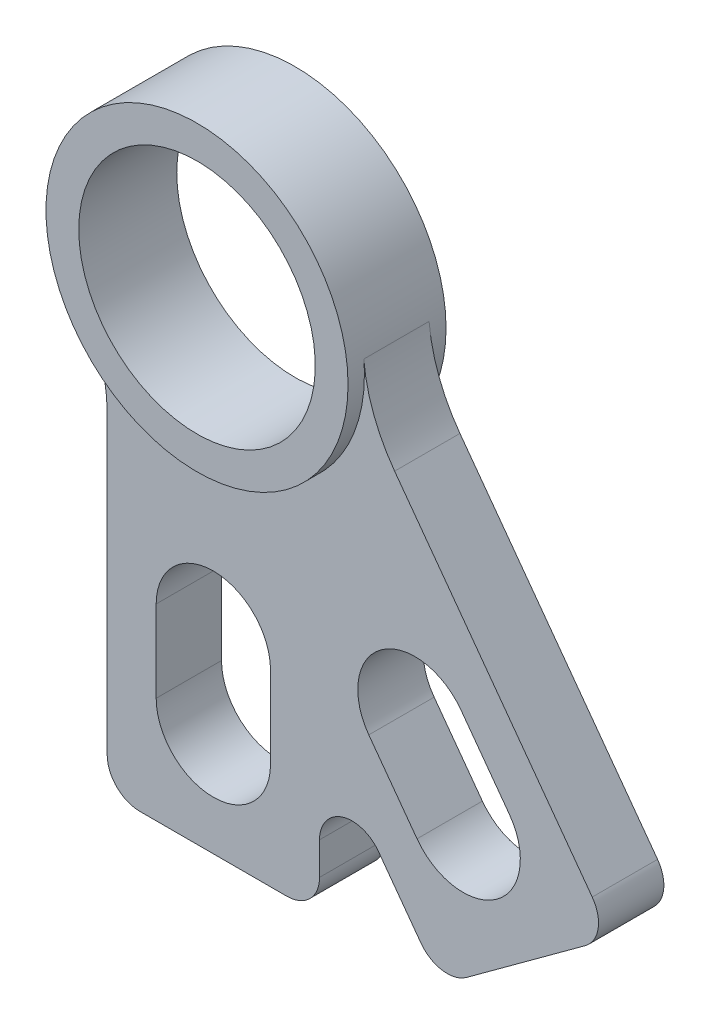
ISO-10303-21;
HEADER;
FILE_DESCRIPTION(('STEP AP214'),'2;1');
FILE_NAME('part.step','',(''),(''),'','','');
FILE_SCHEMA(('AUTOMOTIVE_DESIGN { 1 0 10303 214 1 1 1 1 }'));
ENDSEC;
DATA;
#1=APPLICATION_CONTEXT('core data for automotive mechanical design processes');
#2=APPLICATION_PROTOCOL_DEFINITION('international standard','automotive_design',2000,#1);
#3=PRODUCT_CONTEXT('',#1,'mechanical');
#4=PRODUCT('Part','Part','',(#3));
#5=PRODUCT_RELATED_PRODUCT_CATEGORY('part','',(#4));
#6=PRODUCT_DEFINITION_FORMATION('','',#4);
#7=PRODUCT_DEFINITION_CONTEXT('part definition',#1,'design');
#8=PRODUCT_DEFINITION('design','',#6,#7);
#9=PRODUCT_DEFINITION_SHAPE('','',#8);
#10=(LENGTH_UNIT() NAMED_UNIT(*) SI_UNIT(.MILLI.,.METRE.));
#11=(NAMED_UNIT(*) PLANE_ANGLE_UNIT() SI_UNIT($,.RADIAN.));
#12=(NAMED_UNIT(*) SI_UNIT($,.STERADIAN.) SOLID_ANGLE_UNIT());
#13=UNCERTAINTY_MEASURE_WITH_UNIT(LENGTH_MEASURE(1.E-05),#10,'distance_accuracy_value','');
#14=(GEOMETRIC_REPRESENTATION_CONTEXT(3) GLOBAL_UNCERTAINTY_ASSIGNED_CONTEXT((#13)) GLOBAL_UNIT_ASSIGNED_CONTEXT((#10,
#11,#12)) REPRESENTATION_CONTEXT('',''));
#15=CARTESIAN_POINT('',(0.,0.,0.));
#16=DIRECTION('',(0.,0.,1.));
#17=DIRECTION('',(1.,0.,0.));
#18=AXIS2_PLACEMENT_3D('',#15,#16,#17);
#19=CARTESIAN_POINT('',(0.,0.,4.7625));
#20=DIRECTION('',(0.,0.,-1.));
#21=DIRECTION('',(-1.,0.,0.));
#22=AXIS2_PLACEMENT_3D('',#19,#20,#21);
#23=CYLINDRICAL_SURFACE('',#22,11.495405);
#24=CARTESIAN_POINT('',(0.,0.,4.7625));
#25=DIRECTION('',(0.,0.,1.));
#26=DIRECTION('',(1.,0.,0.));
#27=AXIS2_PLACEMENT_3D('',#24,#25,#26);
#28=CIRCLE('',#27,11.495405);
#29=CARTESIAN_POINT('',(-11.495405,0.,4.7625));
#30=VERTEX_POINT('',#29);
#31=EDGE_CURVE('E358',#30,#30,#28,.T.);
#32=CARTESIAN_POINT('',(0.,0.,-4.7625));
#33=DIRECTION('',(0.,0.,1.));
#34=DIRECTION('',(1.,0.,0.));
#35=AXIS2_PLACEMENT_3D('',#32,#33,#34);
#36=CIRCLE('',#35,11.495405);
#37=CARTESIAN_POINT('',(-11.495405,0.,-4.7625));
#38=VERTEX_POINT('',#37);
#39=EDGE_CURVE('E315',#38,#38,#36,.T.);
#40=CARTESIAN_POINT('',(-11.495405,0.,4.7625));
#41=CARTESIAN_POINT('',(-11.495405,0.,4.66328125));
#42=CARTESIAN_POINT('',(-11.495405,0.,4.5640625));
#43=CARTESIAN_POINT('',(-11.495405,0.,4.365625));
#44=CARTESIAN_POINT('',(-11.495405,0.,4.26640625));
#45=CARTESIAN_POINT('',(-11.495405,0.,4.06796875));
#46=CARTESIAN_POINT('',(-11.495405,0.,3.96875));
#47=CARTESIAN_POINT('',(-11.495405,0.,3.7703125));
#48=CARTESIAN_POINT('',(-11.495405,0.,3.67109375));
#49=CARTESIAN_POINT('',(-11.495405,0.,3.47265625));
#50=CARTESIAN_POINT('',(-11.495405,0.,3.3734375));
#51=CARTESIAN_POINT('',(-11.495405,0.,3.175));
#52=CARTESIAN_POINT('',(-11.495405,0.,3.07578125));
#53=CARTESIAN_POINT('',(-11.495405,0.,2.87734375));
#54=CARTESIAN_POINT('',(-11.495405,0.,2.778125));
#55=CARTESIAN_POINT('',(-11.495405,0.,2.5796875));
#56=CARTESIAN_POINT('',(-11.495405,0.,2.48046875));
#57=CARTESIAN_POINT('',(-11.495405,0.,2.28203125));
#58=CARTESIAN_POINT('',(-11.495405,0.,2.1828125));
#59=CARTESIAN_POINT('',(-11.495405,0.,1.984375));
#60=CARTESIAN_POINT('',(-11.495405,0.,1.88515625));
#61=CARTESIAN_POINT('',(-11.495405,0.,1.68671875));
#62=CARTESIAN_POINT('',(-11.495405,0.,1.5875));
#63=CARTESIAN_POINT('',(-11.495405,0.,1.3890625));
#64=CARTESIAN_POINT('',(-11.495405,0.,1.28984375));
#65=CARTESIAN_POINT('',(-11.495405,0.,1.09140625));
#66=CARTESIAN_POINT('',(-11.495405,0.,0.992187499999999));
#67=CARTESIAN_POINT('',(-11.495405,0.,0.79375));
#68=CARTESIAN_POINT('',(-11.495405,0.,0.69453125));
#69=CARTESIAN_POINT('',(-11.495405,0.,0.49609375));
#70=CARTESIAN_POINT('',(-11.495405,0.,0.396875));
#71=CARTESIAN_POINT('',(-11.495405,0.,0.1984375));
#72=CARTESIAN_POINT('',(-11.495405,0.,0.0992187500000001));
#73=CARTESIAN_POINT('',(-11.495405,0.,-0.0992187500000001));
#74=CARTESIAN_POINT('',(-11.495405,0.,-0.1984375));
#75=CARTESIAN_POINT('',(-11.495405,0.,-0.396875));
#76=CARTESIAN_POINT('',(-11.495405,0.,-0.49609375));
#77=CARTESIAN_POINT('',(-11.495405,0.,-0.69453125));
#78=CARTESIAN_POINT('',(-11.495405,0.,-0.793750000000001));
#79=CARTESIAN_POINT('',(-11.495405,0.,-0.992187500000001));
#80=CARTESIAN_POINT('',(-11.495405,0.,-1.09140625));
#81=CARTESIAN_POINT('',(-11.495405,0.,-1.28984375));
#82=CARTESIAN_POINT('',(-11.495405,0.,-1.3890625));
#83=CARTESIAN_POINT('',(-11.495405,0.,-1.5875));
#84=CARTESIAN_POINT('',(-11.495405,0.,-1.68671875));
#85=CARTESIAN_POINT('',(-11.495405,0.,-1.88515625));
#86=CARTESIAN_POINT('',(-11.495405,0.,-1.984375));
#87=CARTESIAN_POINT('',(-11.495405,0.,-2.1828125));
#88=CARTESIAN_POINT('',(-11.495405,0.,-2.28203125));
#89=CARTESIAN_POINT('',(-11.495405,0.,-2.48046875));
#90=CARTESIAN_POINT('',(-11.495405,0.,-2.5796875));
#91=CARTESIAN_POINT('',(-11.495405,0.,-2.778125));
#92=CARTESIAN_POINT('',(-11.495405,0.,-2.87734375));
#93=CARTESIAN_POINT('',(-11.495405,0.,-3.07578125));
#94=CARTESIAN_POINT('',(-11.495405,0.,-3.175));
#95=CARTESIAN_POINT('',(-11.495405,0.,-3.3734375));
#96=CARTESIAN_POINT('',(-11.495405,0.,-3.47265625));
#97=CARTESIAN_POINT('',(-11.495405,0.,-3.67109375));
#98=CARTESIAN_POINT('',(-11.495405,0.,-3.7703125));
#99=CARTESIAN_POINT('',(-11.495405,0.,-3.96875));
#100=CARTESIAN_POINT('',(-11.495405,0.,-4.06796875));
#101=CARTESIAN_POINT('',(-11.495405,0.,-4.26640625));
#102=CARTESIAN_POINT('',(-11.495405,0.,-4.365625));
#103=CARTESIAN_POINT('',(-11.495405,0.,-4.5640625));
#104=CARTESIAN_POINT('',(-11.495405,0.,-4.66328125));
#105=CARTESIAN_POINT('',(-11.495405,0.,-4.7625));
#106=B_SPLINE_CURVE_WITH_KNOTS('',3,(#40,#41,#42,#43,#44,#45,#46,#47,#48,#49,#50,#51,#52,#53,
#54,#55,#56,#57,#58,#59,#60,#61,#62,#63,#64,#65,#66,#67,#68,#69,#70,#71,#72,#73,#74,#75,#76,#77,
#78,#79,#80,#81,#82,#83,#84,#85,#86,#87,#88,#89,#90,#91,#92,#93,#94,#95,#96,#97,#98,#99,#100,
#101,#102,#103,#104,#105),.UNSPECIFIED.,.F.,.F.,(4,2,2,2,2,2,2,2,2,2,2,2,2,2,2,2,2,2,2,2,2,2,2,
2,2,2,2,2,2,2,2,2,4),(0.,0.29765625,0.5953125,0.892968750000001,1.190625,1.48828125,1.7859375,
2.08359375,2.38125,2.67890625,2.9765625,3.27421875,3.571875,3.86953125,4.1671875,4.46484375,
4.7625,5.06015625,5.3578125,5.65546875,5.953125,6.25078125,6.5484375,6.84609375,7.14375,
7.44140625,7.7390625,8.03671875,8.334375,8.63203125,8.9296875,9.22734375,9.525),.UNSPECIFIED.);
#107=EDGE_CURVE('BSEAM43',#30,#38,#106,.T.);
#108=ORIENTED_EDGE('',*,*,#31,.T.);
#109=ORIENTED_EDGE('',*,*,#39,.F.);
#110=ORIENTED_EDGE('',*,*,#107,.T.);
#111=ORIENTED_EDGE('',*,*,#107,.F.);
#112=EDGE_LOOP('',(#108,#110,#109,#111));
#113=FACE_BOUND('',#112,.T.);
#114=ADVANCED_FACE('F43',(#113),#23,.F.);
#115=CARTESIAN_POINT('',(0.,0.,4.7625));
#116=DIRECTION('',(0.,0.,-1.));
#117=DIRECTION('',(-1.,0.,0.));
#118=AXIS2_PLACEMENT_3D('',#115,#116,#117);
#119=CYLINDRICAL_SURFACE('',#118,14.6812);
#120=DIRECTION('',(0.,0.,-1.));
#121=VECTOR('',#120,1.);
#122=CARTESIAN_POINT('',(-12.585193266832,-7.55979787272687,3.175));
#123=LINE('',#122,#121);
#124=CARTESIAN_POINT('',(-12.585193266832,-7.55979787272688,3.175));
#125=VERTEX_POINT('',#124);
#126=CARTESIAN_POINT('',(-12.585193266832,-7.55979787272687,-3.175));
#127=VERTEX_POINT('',#126);
#128=EDGE_CURVE('E228',#125,#127,#123,.T.);
#129=ORIENTED_EDGE('',*,*,#128,.F.);
#130=CARTESIAN_POINT('',(0.,0.,3.175));
#131=DIRECTION('',(0.,0.,1.));
#132=DIRECTION('',(1.,0.,0.));
#133=AXIS2_PLACEMENT_3D('',#130,#131,#132);
#134=CIRCLE('',#133,14.6812);
#135=CARTESIAN_POINT('',(14.6206592886557,1.33189917224908,3.175));
#136=VERTEX_POINT('',#135);
#137=EDGE_CURVE('E244',#125,#136,#134,.T.);
#138=ORIENTED_EDGE('',*,*,#137,.T.);
#139=DIRECTION('',(0.,0.,-1.));
#140=VECTOR('',#139,1.);
#141=CARTESIAN_POINT('',(14.620659288656,1.33189917224865,3.175));
#142=LINE('',#141,#140);
#143=CARTESIAN_POINT('',(14.620659288656,1.33189917224865,-3.175));
#144=VERTEX_POINT('',#143);
#145=EDGE_CURVE('E350',#136,#144,#142,.T.);
#146=ORIENTED_EDGE('',*,*,#145,.T.);
#147=CARTESIAN_POINT('',(0.,0.,-3.175));
#148=DIRECTION('',(0.,0.,1.));
#149=DIRECTION('',(1.,0.,0.));
#150=AXIS2_PLACEMENT_3D('',#147,#148,#149);
#151=CIRCLE('',#150,14.6812);
#152=EDGE_CURVE('E513',#127,#144,#151,.T.);
#153=ORIENTED_EDGE('',*,*,#152,.F.);
#154=EDGE_LOOP('',(#129,#138,#146,#153));
#155=FACE_BOUND('',#154,.T.);
#156=CARTESIAN_POINT('',(0.,0.,4.7625));
#157=DIRECTION('',(0.,0.,1.));
#158=DIRECTION('',(1.,0.,0.));
#159=AXIS2_PLACEMENT_3D('',#156,#157,#158);
#160=CIRCLE('',#159,14.6812);
#161=CARTESIAN_POINT('',(14.6812,0.,4.7625));
#162=VERTEX_POINT('',#161);
#163=EDGE_CURVE('E478',#162,#162,#160,.T.);
#164=ORIENTED_EDGE('',*,*,#163,.F.);
#165=EDGE_LOOP('',(#164));
#166=FACE_BOUND('',#165,.T.);
#167=CARTESIAN_POINT('',(0.,0.,-4.7625));
#168=DIRECTION('',(0.,0.,1.));
#169=DIRECTION('',(1.,0.,0.));
#170=AXIS2_PLACEMENT_3D('',#167,#168,#169);
#171=CIRCLE('',#170,14.6812);
#172=CARTESIAN_POINT('',(14.6812,0.,-4.7625));
#173=VERTEX_POINT('',#172);
#174=EDGE_CURVE('E842',#173,#173,#171,.T.);
#175=ORIENTED_EDGE('',*,*,#174,.T.);
#176=EDGE_LOOP('',(#175));
#177=FACE_BOUND('',#176,.T.);
#178=ADVANCED_FACE('F600',(#155,#166,#177),#119,.T.);
#179=CARTESIAN_POINT('',(0.,0.,4.7625));
#180=DIRECTION('',(0.,0.,1.));
#181=DIRECTION('',(1.,0.,0.));
#182=AXIS2_PLACEMENT_3D('',#179,#180,#181);
#183=PLANE('',#182);
#184=ORIENTED_EDGE('',*,*,#31,.F.);
#185=EDGE_LOOP('',(#184));
#186=FACE_BOUND('',#185,.T.);
#187=ORIENTED_EDGE('',*,*,#163,.T.);
#188=EDGE_LOOP('',(#187));
#189=FACE_BOUND('',#188,.T.);
#190=ADVANCED_FACE('F606',(#186,#189),#183,.T.);
#191=CARTESIAN_POINT('',(0.,0.,-4.7625));
#192=DIRECTION('',(0.,0.,1.));
#193=DIRECTION('',(1.,0.,0.));
#194=AXIS2_PLACEMENT_3D('',#191,#192,#193);
#195=PLANE('',#194);
#196=ORIENTED_EDGE('',*,*,#39,.T.);
#197=EDGE_LOOP('',(#196));
#198=FACE_BOUND('',#197,.T.);
#199=ORIENTED_EDGE('',*,*,#174,.F.);
#200=EDGE_LOOP('',(#199));
#201=FACE_BOUND('',#200,.T.);
#202=ADVANCED_FACE('F611',(#198,#201),#195,.F.);
#203=CARTESIAN_POINT('',(0.,-29.3687499999984,3.175));
#204=DIRECTION('',(0.,0.,-1.));
#205=DIRECTION('',(-1.,0.,0.));
#206=AXIS2_PLACEMENT_3D('',#203,#204,#205);
#207=CYLINDRICAL_SURFACE('',#206,5.55624999999838);
#208=CARTESIAN_POINT('',(0.,-29.3687499999984,-3.175));
#209=DIRECTION('',(0.,0.,1.));
#210=DIRECTION('',(1.,0.,0.));
#211=AXIS2_PLACEMENT_3D('',#208,#209,#210);
#212=CIRCLE('',#211,5.55624999999838);
#213=CARTESIAN_POINT('',(5.55624999999832,-29.3687499999984,-3.175));
#214=VERTEX_POINT('',#213);
#215=CARTESIAN_POINT('',(-5.55624999999843,-29.3687499999984,-3.175));
#216=VERTEX_POINT('',#215);
#217=EDGE_CURVE('E409',#214,#216,#212,.T.);
#218=ORIENTED_EDGE('',*,*,#217,.F.);
#219=DIRECTION('',(0.,0.,-1.));
#220=VECTOR('',#219,1.);
#221=CARTESIAN_POINT('',(5.55624999999832,-29.3687499999984,3.175));
#222=LINE('',#221,#220);
#223=CARTESIAN_POINT('',(5.55624999999832,-29.3687499999984,3.175));
#224=VERTEX_POINT('',#223);
#225=EDGE_CURVE('E311',#224,#214,#222,.T.);
#226=ORIENTED_EDGE('',*,*,#225,.F.);
#227=CARTESIAN_POINT('',(0.,-29.3687499999984,3.175));
#228=DIRECTION('',(0.,0.,1.));
#229=DIRECTION('',(1.,0.,0.));
#230=AXIS2_PLACEMENT_3D('',#227,#228,#229);
#231=CIRCLE('',#230,5.55624999999838);
#232=CARTESIAN_POINT('',(-5.55624999999843,-29.3687499999984,3.175));
#233=VERTEX_POINT('',#232);
#234=EDGE_CURVE('E288',#224,#233,#231,.T.);
#235=ORIENTED_EDGE('',*,*,#234,.T.);
#236=DIRECTION('',(0.,0.,-1.));
#237=VECTOR('',#236,1.);
#238=CARTESIAN_POINT('',(-5.55624999999843,-29.3687499999984,3.175));
#239=LINE('',#238,#237);
#240=EDGE_CURVE('E334',#233,#216,#239,.T.);
#241=ORIENTED_EDGE('',*,*,#240,.T.);
#242=EDGE_LOOP('',(#218,#226,#235,#241));
#243=FACE_BOUND('',#242,.T.);
#244=ADVANCED_FACE('F432',(#243),#207,.F.);
#245=CARTESIAN_POINT('',(5.55624999999988,-2.93862156830347E-13,3.175));
#246=DIRECTION('',(-1.,0.,0.));
#247=DIRECTION('',(0.,-1.,0.));
#248=AXIS2_PLACEMENT_3D('',#245,#246,#247);
#249=PLANE('',#248);
#250=DIRECTION('',(0.,1.,0.));
#251=VECTOR('',#250,1.);
#252=CARTESIAN_POINT('',(5.55624999999988,-2.93862156830347E-13,-3.175));
#253=LINE('',#252,#251);
#254=CARTESIAN_POINT('',(5.5562499999979,-37.3062500000015,-3.175));
#255=VERTEX_POINT('',#254);
#256=EDGE_CURVE('E412',#255,#214,#253,.T.);
#257=ORIENTED_EDGE('',*,*,#256,.F.);
#258=DIRECTION('',(0.,0.,-1.));
#259=VECTOR('',#258,1.);
#260=CARTESIAN_POINT('',(5.5562499999979,-37.3062500000015,3.175));
#261=LINE('',#260,#259);
#262=CARTESIAN_POINT('',(5.5562499999979,-37.3062500000015,3.175));
#263=VERTEX_POINT('',#262);
#264=EDGE_CURVE('E316',#263,#255,#261,.T.);
#265=ORIENTED_EDGE('',*,*,#264,.F.);
#266=DIRECTION('',(0.,1.,0.));
#267=VECTOR('',#266,1.);
#268=CARTESIAN_POINT('',(5.55624999999988,-2.93862156830347E-13,3.175));
#269=LINE('',#268,#267);
#270=EDGE_CURVE('E292',#263,#224,#269,.T.);
#271=ORIENTED_EDGE('',*,*,#270,.T.);
#272=ORIENTED_EDGE('',*,*,#225,.T.);
#273=EDGE_LOOP('',(#257,#265,#271,#272));
#274=FACE_BOUND('',#273,.T.);
#275=ADVANCED_FACE('F438',(#274),#249,.T.);
#276=CARTESIAN_POINT('',(7.71771132129446E-13,-37.3062500000015,3.175));
#277=DIRECTION('',(0.,0.,-1.));
#278=DIRECTION('',(-1.,0.,0.));
#279=AXIS2_PLACEMENT_3D('',#276,#277,#278);
#280=CYLINDRICAL_SURFACE('',#279,5.55624999999779);
#281=CARTESIAN_POINT('',(7.71771132129446E-13,-37.3062500000015,-3.175));
#282=DIRECTION('',(0.,0.,1.));
#283=DIRECTION('',(1.,0.,0.));
#284=AXIS2_PLACEMENT_3D('',#281,#282,#283);
#285=CIRCLE('',#284,5.55624999999779);
#286=CARTESIAN_POINT('',(-5.55624999999768,-37.3062500000015,-3.175));
#287=VERTEX_POINT('',#286);
#288=EDGE_CURVE('E417',#287,#255,#285,.T.);
#289=ORIENTED_EDGE('',*,*,#288,.F.);
#290=DIRECTION('',(0.,0.,-1.));
#291=VECTOR('',#290,1.);
#292=CARTESIAN_POINT('',(-5.55624999999768,-37.3062500000015,3.175));
#293=LINE('',#292,#291);
#294=CARTESIAN_POINT('',(-5.55624999999768,-37.3062500000015,3.175));
#295=VERTEX_POINT('',#294);
#296=EDGE_CURVE('E337',#295,#287,#293,.T.);
#297=ORIENTED_EDGE('',*,*,#296,.F.);
#298=CARTESIAN_POINT('',(7.71771132129446E-13,-37.3062500000015,3.175));
#299=DIRECTION('',(0.,0.,1.));
#300=DIRECTION('',(1.,0.,0.));
#301=AXIS2_PLACEMENT_3D('',#298,#299,#300);
#302=CIRCLE('',#301,5.55624999999779);
#303=EDGE_CURVE('E297',#295,#263,#302,.T.);
#304=ORIENTED_EDGE('',*,*,#303,.T.);
#305=ORIENTED_EDGE('',*,*,#264,.T.);
#306=EDGE_LOOP('',(#289,#297,#304,#305));
#307=FACE_BOUND('',#306,.T.);
#308=ADVANCED_FACE('F642',(#307),#280,.F.);
#309=CARTESIAN_POINT('',(19.594586402296,-26.774645381131,3.175));
#310=DIRECTION('',(0.,0.,-1.));
#311=DIRECTION('',(-1.,0.,0.));
#312=AXIS2_PLACEMENT_3D('',#309,#310,#311);
#313=CYLINDRICAL_SURFACE('',#312,5.55624999999852);
#314=CARTESIAN_POINT('',(19.594586402296,-26.774645381131,-3.175));
#315=DIRECTION('',(0.,0.,1.));
#316=DIRECTION('',(1.,0.,0.));
#317=AXIS2_PLACEMENT_3D('',#314,#315,#316);
#318=CIRCLE('',#317,5.55624999999852);
#319=CARTESIAN_POINT('',(24.078378691002,-23.4932553137613,-3.175));
#320=VERTEX_POINT('',#319);
#321=CARTESIAN_POINT('',(15.1107941135917,-30.0560354485005,-3.175));
#322=VERTEX_POINT('',#321);
#323=EDGE_CURVE('E390',#320,#322,#318,.T.);
#324=ORIENTED_EDGE('',*,*,#323,.F.);
#325=DIRECTION('',(0.,0.,-1.));
#326=VECTOR('',#325,1.);
#327=CARTESIAN_POINT('',(24.078378691002,-23.4932553137613,3.175));
#328=LINE('',#327,#326);
#329=CARTESIAN_POINT('',(24.078378691002,-23.4932553137613,3.175));
#330=VERTEX_POINT('',#329);
#331=EDGE_CURVE('E338',#330,#320,#328,.T.);
#332=ORIENTED_EDGE('',*,*,#331,.F.);
#333=CARTESIAN_POINT('',(19.594586402296,-26.774645381131,3.175));
#334=DIRECTION('',(0.,0.,1.));
#335=DIRECTION('',(1.,0.,0.));
#336=AXIS2_PLACEMENT_3D('',#333,#334,#335);
#337=CIRCLE('',#336,5.55624999999852);
#338=CARTESIAN_POINT('',(15.1107941135917,-30.0560354485005,3.175));
#339=VERTEX_POINT('',#338);
#340=EDGE_CURVE('E263',#330,#339,#337,.T.);
#341=ORIENTED_EDGE('',*,*,#340,.T.);
#342=DIRECTION('',(0.,0.,-1.));
#343=VECTOR('',#342,1.);
#344=CARTESIAN_POINT('',(15.1107941135917,-30.0560354485005,3.175));
#345=LINE('',#344,#343);
#346=EDGE_CURVE('E319',#339,#322,#345,.T.);
#347=ORIENTED_EDGE('',*,*,#346,.T.);
#348=EDGE_LOOP('',(#324,#332,#341,#347));
#349=FACE_BOUND('',#348,.T.);
#350=ADVANCED_FACE('F638',(#349),#313,.F.);
#351=CARTESIAN_POINT('',(4.48379228870516,3.28139006736958,3.175));
#352=DIRECTION('',(-0.806981739249737,-0.590576390077921,0.));
#353=DIRECTION('',(0.590576390077921,-0.806981739249738,0.));
#354=AXIS2_PLACEMENT_3D('',#351,#352,#353);
#355=PLANE('',#354);
#356=DIRECTION('',(-0.590576390077921,0.806981739249737,0.));
#357=VECTOR('',#356,1.);
#358=CARTESIAN_POINT('',(4.48379228870516,3.28139006736958,-3.175));
#359=LINE('',#358,#357);
#360=CARTESIAN_POINT('',(28.7660787872476,-29.8986728690589,-3.175));
#361=VERTEX_POINT('',#360);
#362=EDGE_CURVE('E396',#361,#320,#359,.T.);
#363=ORIENTED_EDGE('',*,*,#362,.F.);
#364=DIRECTION('',(0.,0.,-1.));
#365=VECTOR('',#364,1.);
#366=CARTESIAN_POINT('',(28.7660787872476,-29.8986728690589,3.175));
#367=LINE('',#366,#365);
#368=CARTESIAN_POINT('',(28.7660787872476,-29.8986728690589,3.175));
#369=VERTEX_POINT('',#368);
#370=EDGE_CURVE('E348',#369,#361,#367,.T.);
#371=ORIENTED_EDGE('',*,*,#370,.F.);
#372=DIRECTION('',(-0.590576390077921,0.806981739249737,0.));
#373=VECTOR('',#372,1.);
#374=CARTESIAN_POINT('',(4.48379228870516,3.28139006736958,3.175));
#375=LINE('',#374,#373);
#376=EDGE_CURVE('E268',#369,#330,#375,.T.);
#377=ORIENTED_EDGE('',*,*,#376,.T.);
#378=ORIENTED_EDGE('',*,*,#331,.T.);
#379=EDGE_LOOP('',(#363,#371,#377,#378));
#380=FACE_BOUND('',#379,.T.);
#381=ADVANCED_FACE('F641',(#380),#355,.T.);
#382=CARTESIAN_POINT('',(24.282286498542,-33.1800629364281,3.175));
#383=DIRECTION('',(0.,0.,-1.));
#384=DIRECTION('',(-1.,0.,0.));
#385=AXIS2_PLACEMENT_3D('',#382,#383,#384);
#386=CYLINDRICAL_SURFACE('',#385,5.55624999999852);
#387=CARTESIAN_POINT('',(24.282286498542,-33.1800629364281,-3.175));
#388=DIRECTION('',(0.,0.,1.));
#389=DIRECTION('',(1.,0.,0.));
#390=AXIS2_PLACEMENT_3D('',#387,#388,#389);
#391=CIRCLE('',#390,5.55624999999852);
#392=CARTESIAN_POINT('',(19.7984942098372,-36.4614530037981,-3.175));
#393=VERTEX_POINT('',#392);
#394=EDGE_CURVE('E403',#393,#361,#391,.T.);
#395=ORIENTED_EDGE('',*,*,#394,.F.);
#396=DIRECTION('',(0.,0.,-1.));
#397=VECTOR('',#396,1.);
#398=CARTESIAN_POINT('',(19.7984942098372,-36.4614530037981,3.175));
#399=LINE('',#398,#397);
#400=CARTESIAN_POINT('',(19.7984942098372,-36.4614530037981,3.175));
#401=VERTEX_POINT('',#400);
#402=EDGE_CURVE('E323',#401,#393,#399,.T.);
#403=ORIENTED_EDGE('',*,*,#402,.F.);
#404=CARTESIAN_POINT('',(24.282286498542,-33.1800629364281,3.175));
#405=DIRECTION('',(0.,0.,1.));
#406=DIRECTION('',(1.,0.,0.));
#407=AXIS2_PLACEMENT_3D('',#404,#405,#406);
#408=CIRCLE('',#407,5.55624999999852);
#409=EDGE_CURVE('E275',#401,#369,#408,.T.);
#410=ORIENTED_EDGE('',*,*,#409,.T.);
#411=ORIENTED_EDGE('',*,*,#370,.T.);
#412=EDGE_LOOP('',(#395,#403,#410,#411));
#413=FACE_BOUND('',#412,.T.);
#414=ADVANCED_FACE('F620',(#413),#386,.F.);
#415=CARTESIAN_POINT('',(-26.1937499999968,-15.7343197939273,3.175));
#416=DIRECTION('',(0.,0.,-1.));
#417=DIRECTION('',(-1.,0.,0.));
#418=AXIS2_PLACEMENT_3D('',#415,#416,#417);
#419=CYLINDRICAL_SURFACE('',#418,15.8749999999984);
#420=CARTESIAN_POINT('',(-26.1937499999968,-15.7343197939273,-3.175));
#421=DIRECTION('',(0.,0.,1.));
#422=DIRECTION('',(1.,0.,0.));
#423=AXIS2_PLACEMENT_3D('',#420,#421,#422);
#424=CIRCLE('',#423,15.8749999999984);
#425=CARTESIAN_POINT('',(-10.3187499999984,-15.7343197939273,-3.175));
#426=VERTEX_POINT('',#425);
#427=EDGE_CURVE('E223',#426,#127,#424,.T.);
#428=ORIENTED_EDGE('',*,*,#427,.F.);
#429=DIRECTION('',(0.,0.,-1.));
#430=VECTOR('',#429,1.);
#431=CARTESIAN_POINT('',(-10.3187499999984,-15.7343197939273,3.175));
#432=LINE('',#431,#430);
#433=CARTESIAN_POINT('',(-10.3187499999984,-15.7343197939273,3.175));
#434=VERTEX_POINT('',#433);
#435=EDGE_CURVE('E216',#434,#426,#432,.T.);
#436=ORIENTED_EDGE('',*,*,#435,.F.);
#437=CARTESIAN_POINT('',(-26.1937499999968,-15.7343197939273,3.175));
#438=DIRECTION('',(0.,0.,1.));
#439=DIRECTION('',(1.,0.,0.));
#440=AXIS2_PLACEMENT_3D('',#437,#438,#439);
#441=CIRCLE('',#440,15.8749999999984);
#442=EDGE_CURVE('E221',#434,#125,#441,.T.);
#443=ORIENTED_EDGE('',*,*,#442,.T.);
#444=ORIENTED_EDGE('',*,*,#128,.T.);
#445=EDGE_LOOP('',(#428,#436,#443,#444));
#446=FACE_BOUND('',#445,.T.);
#447=ADVANCED_FACE('F218',(#446),#419,.F.);
#448=CARTESIAN_POINT('',(-10.3187499999987,-2.23396639561212E-13,3.175));
#449=DIRECTION('',(1.,0.,0.));
#450=DIRECTION('',(0.,1.,0.));
#451=AXIS2_PLACEMENT_3D('',#448,#449,#450);
#452=PLANE('',#451);
#453=DIRECTION('',(0.,-1.,0.));
#454=VECTOR('',#453,1.);
#455=CARTESIAN_POINT('',(-10.3187499999987,-2.23396639561212E-13,-3.175));
#456=LINE('',#455,#454);
#457=CARTESIAN_POINT('',(-10.3187499999978,-44.4500000000001,-3.175));
#458=VERTEX_POINT('',#457);
#459=EDGE_CURVE('E373',#426,#458,#456,.T.);
#460=ORIENTED_EDGE('',*,*,#459,.T.);
#461=DIRECTION('',(0.,0.,-1.));
#462=VECTOR('',#461,1.);
#463=CARTESIAN_POINT('',(-10.3187499999978,-44.4500000000001,3.175));
#464=LINE('',#463,#462);
#465=CARTESIAN_POINT('',(-10.3187499999978,-44.4500000000001,3.175));
#466=VERTEX_POINT('',#465);
#467=EDGE_CURVE('E235',#458,#466,#464,.F.);
#468=ORIENTED_EDGE('',*,*,#467,.T.);
#469=DIRECTION('',(0.,-1.,0.));
#470=VECTOR('',#469,1.);
#471=CARTESIAN_POINT('',(-10.3187499999987,-2.23396639561212E-13,3.175));
#472=LINE('',#471,#470);
#473=EDGE_CURVE('E232',#434,#466,#472,.T.);
#474=ORIENTED_EDGE('',*,*,#473,.F.);
#475=ORIENTED_EDGE('',*,*,#435,.T.);
#476=EDGE_LOOP('',(#460,#468,#474,#475));
#477=FACE_BOUND('',#476,.T.);
#478=ADVANCED_FACE('F233',(#477),#452,.F.);
#479=CARTESIAN_POINT('',(0.,-47.625,3.175));
#480=DIRECTION('',(0.,1.,0.));
#481=DIRECTION('',(-1.,0.,0.));
#482=AXIS2_PLACEMENT_3D('',#479,#480,#481);
#483=PLANE('',#482);
#484=DIRECTION('',(1.,0.,0.));
#485=VECTOR('',#484,1.);
#486=CARTESIAN_POINT('',(0.,-47.625,3.175));
#487=LINE('',#486,#485);
#488=CARTESIAN_POINT('',(-7.14374999999776,-47.625,3.175));
#489=VERTEX_POINT('',#488);
#490=CARTESIAN_POINT('',(7.14374999999889,-47.625,3.175));
#491=VERTEX_POINT('',#490);
#492=EDGE_CURVE('E238',#489,#491,#487,.T.);
#493=ORIENTED_EDGE('',*,*,#492,.F.);
#494=DIRECTION('',(0.,0.,-1.));
#495=VECTOR('',#494,1.);
#496=CARTESIAN_POINT('',(-7.14374999999776,-47.625,3.175));
#497=LINE('',#496,#495);
#498=CARTESIAN_POINT('',(-7.14374999999776,-47.625,-3.175));
#499=VERTEX_POINT('',#498);
#500=EDGE_CURVE('E477',#489,#499,#497,.T.);
#501=ORIENTED_EDGE('',*,*,#500,.T.);
#502=DIRECTION('',(1.,0.,0.));
#503=VECTOR('',#502,1.);
#504=CARTESIAN_POINT('',(0.,-47.625,-3.175));
#505=LINE('',#504,#503);
#506=CARTESIAN_POINT('',(7.14374999999889,-47.625,-3.175));
#507=VERTEX_POINT('',#506);
#508=EDGE_CURVE('E368',#499,#507,#505,.T.);
#509=ORIENTED_EDGE('',*,*,#508,.T.);
#510=DIRECTION('',(0.,0.,-1.));
#511=VECTOR('',#510,1.);
#512=CARTESIAN_POINT('',(7.14374999999889,-47.625,3.175));
#513=LINE('',#512,#511);
#514=EDGE_CURVE('E475',#507,#491,#513,.F.);
#515=ORIENTED_EDGE('',*,*,#514,.T.);
#516=EDGE_LOOP('',(#493,#501,#509,#515));
#517=FACE_BOUND('',#516,.T.);
#518=ADVANCED_FACE('F578',(#517),#483,.F.);
#519=CARTESIAN_POINT('',(10.3187499999941,1.1050452570317E-12,3.175));
#520=DIRECTION('',(-1.,-1.07091000075816E-13,0.));
#521=DIRECTION('',(1.07091000075816E-13,-1.,0.));
#522=AXIS2_PLACEMENT_3D('',#519,#520,#521);
#523=PLANE('',#522);
#524=DIRECTION('',(-1.07091000075816E-13,1.,0.));
#525=VECTOR('',#524,1.);
#526=CARTESIAN_POINT('',(10.3187499999941,1.1050452570317E-12,-3.175));
#527=LINE('',#526,#525);
#528=CARTESIAN_POINT('',(10.3187499999989,-44.4499999999997,-3.175));
#529=VERTEX_POINT('',#528);
#530=CARTESIAN_POINT('',(10.3187499999986,-41.2867162549135,-3.175));
#531=VERTEX_POINT('',#530);
#532=EDGE_CURVE('E372',#529,#531,#527,.T.);
#533=ORIENTED_EDGE('',*,*,#532,.T.);
#534=DIRECTION('',(0.,0.,-1.));
#535=VECTOR('',#534,1.);
#536=CARTESIAN_POINT('',(10.3187499999986,-41.2867162549135,3.175));
#537=LINE('',#536,#535);
#538=CARTESIAN_POINT('',(10.3187499999986,-41.2867162549135,3.175));
#539=VERTEX_POINT('',#538);
#540=EDGE_CURVE('E455',#531,#539,#537,.F.);
#541=ORIENTED_EDGE('',*,*,#540,.T.);
#542=DIRECTION('',(-1.07091000075816E-13,1.,0.));
#543=VECTOR('',#542,1.);
#544=CARTESIAN_POINT('',(10.3187499999941,1.1050452570317E-12,3.175));
#545=LINE('',#544,#543);
#546=CARTESIAN_POINT('',(10.3187499999989,-44.4499999999997,3.175));
#547=VERTEX_POINT('',#546);
#548=EDGE_CURVE('E453',#547,#539,#545,.T.);
#549=ORIENTED_EDGE('',*,*,#548,.F.);
#550=DIRECTION('',(0.,0.,-1.));
#551=VECTOR('',#550,1.);
#552=CARTESIAN_POINT('',(10.3187499999989,-44.4499999999997,3.175));
#553=LINE('',#552,#551);
#554=EDGE_CURVE('E446',#547,#529,#553,.T.);
#555=ORIENTED_EDGE('',*,*,#554,.T.);
#556=EDGE_LOOP('',(#533,#541,#549,#555));
#557=FACE_BOUND('',#556,.T.);
#558=ADVANCED_FACE('F587',(#557),#523,.F.);
#559=CARTESIAN_POINT('',(-8.32704282188164,-6.09401012511538,3.175));
#560=DIRECTION('',(-0.806981739249738,-0.590576390077921,0.));
#561=DIRECTION('',(0.590576390077921,-0.806981739249738,0.));
#562=AXIS2_PLACEMENT_3D('',#559,#560,#561);
#563=PLANE('',#562);
#564=DIRECTION('',(-0.590576390077921,0.806981739249738,0.));
#565=VECTOR('',#564,1.);
#566=CARTESIAN_POINT('',(-8.32704282188164,-6.09401012511538,3.175));
#567=LINE('',#566,#565);
#568=CARTESIAN_POINT('',(20.1741737632788,-45.0389488613077,3.175));
#569=VERTEX_POINT('',#568);
#570=CARTESIAN_POINT('',(16.0559170221165,-39.4116362164157,3.175));
#571=VERTEX_POINT('',#570);
#572=EDGE_CURVE('E449',#569,#571,#567,.T.);
#573=ORIENTED_EDGE('',*,*,#572,.T.);
#574=DIRECTION('',(0.,0.,-1.));
#575=VECTOR('',#574,1.);
#576=CARTESIAN_POINT('',(16.0559170221165,-39.4116362164157,3.175));
#577=LINE('',#576,#575);
#578=CARTESIAN_POINT('',(16.0559170221165,-39.4116362164157,-3.175));
#579=VERTEX_POINT('',#578);
#580=EDGE_CURVE('E443',#571,#579,#577,.T.);
#581=ORIENTED_EDGE('',*,*,#580,.T.);
#582=DIRECTION('',(-0.590576390077921,0.806981739249738,0.));
#583=VECTOR('',#582,1.);
#584=CARTESIAN_POINT('',(-8.32704282188164,-6.09401012511538,-3.175));
#585=LINE('',#584,#583);
#586=CARTESIAN_POINT('',(20.1741737632788,-45.0389488613077,-3.175));
#587=VERTEX_POINT('',#586);
#588=EDGE_CURVE('E379',#587,#579,#585,.T.);
#589=ORIENTED_EDGE('',*,*,#588,.F.);
#590=DIRECTION('',(0.,0.,-1.));
#591=VECTOR('',#590,1.);
#592=CARTESIAN_POINT('',(20.1741737632788,-45.0389488613077,3.175));
#593=LINE('',#592,#591);
#594=EDGE_CURVE('E447',#587,#569,#593,.F.);
#595=ORIENTED_EDGE('',*,*,#594,.T.);
#596=EDGE_LOOP('',(#573,#581,#589,#595));
#597=FACE_BOUND('',#596,.T.);
#598=ADVANCED_FACE('F534',(#597),#563,.T.);
#599=CARTESIAN_POINT('',(30.3762966236595,-41.5071057583086,3.175));
#600=DIRECTION('',(-0.590576390077956,0.806981739249712,0.));
#601=DIRECTION('',(-0.806981739249712,-0.590576390077956,0.));
#602=AXIS2_PLACEMENT_3D('',#599,#600,#601);
#603=PLANE('',#602);
#604=DIRECTION('',(0.806981739249712,0.590576390077956,0.));
#605=VECTOR('',#604,1.);
#606=CARTESIAN_POINT('',(30.3762966236595,-41.5071057583086,3.175));
#607=LINE('',#606,#605);
#608=CARTESIAN_POINT('',(24.6114208238942,-45.7260358449281,3.175));
#609=VERTEX_POINT('',#608);
#610=CARTESIAN_POINT('',(36.1411724234218,-37.2881756716912,3.175));
#611=VERTEX_POINT('',#610);
#612=EDGE_CURVE('E452',#609,#611,#607,.T.);
#613=ORIENTED_EDGE('',*,*,#612,.F.);
#614=DIRECTION('',(0.,0.,-1.));
#615=VECTOR('',#614,1.);
#616=CARTESIAN_POINT('',(24.6114208238942,-45.7260358449281,-3.175));
#617=LINE('',#616,#615);
#618=CARTESIAN_POINT('',(24.6114208238942,-45.7260358449281,-3.175));
#619=VERTEX_POINT('',#618);
#620=EDGE_CURVE('E480',#609,#619,#617,.T.);
#621=ORIENTED_EDGE('',*,*,#620,.T.);
#622=DIRECTION('',(0.806981739249712,0.590576390077956,0.));
#623=VECTOR('',#622,1.);
#624=CARTESIAN_POINT('',(30.3762966236595,-41.5071057583086,-3.175));
#625=LINE('',#624,#623);
#626=CARTESIAN_POINT('',(36.1411724234218,-37.2881756716912,-3.175));
#627=VERTEX_POINT('',#626);
#628=EDGE_CURVE('E500',#619,#627,#625,.T.);
#629=ORIENTED_EDGE('',*,*,#628,.T.);
#630=DIRECTION('',(0.,0.,-1.));
#631=VECTOR('',#630,1.);
#632=CARTESIAN_POINT('',(36.1411724234218,-37.2881756716912,3.175));
#633=LINE('',#632,#631);
#634=EDGE_CURVE('E71',#627,#611,#633,.F.);
#635=ORIENTED_EDGE('',*,*,#634,.T.);
#636=EDGE_LOOP('',(#613,#621,#629,#635));
#637=FACE_BOUND('',#636,.T.);
#638=ADVANCED_FACE('F541',(#637),#603,.F.);
#639=CARTESIAN_POINT('',(8.32704282188122,6.09401012511534,3.175));
#640=DIRECTION('',(-0.806981739249725,-0.590576390077938,0.));
#641=DIRECTION('',(0.590576390077938,-0.806981739249725,0.));
#642=AXIS2_PLACEMENT_3D('',#639,#640,#641);
#643=PLANE('',#642);
#644=DIRECTION('',(-0.590576390077938,0.806981739249725,0.));
#645=VECTOR('',#644,1.);
#646=CARTESIAN_POINT('',(8.32704282188122,6.09401012511534,3.175));
#647=LINE('',#646,#645);
#648=CARTESIAN_POINT('',(36.8282594070422,-32.850928611076,3.175));
#649=VERTEX_POINT('',#648);
#650=CARTESIAN_POINT('',(17.6193606061111,-6.60329862810016,3.175));
#651=VERTEX_POINT('',#650);
#652=EDGE_CURVE('E486',#649,#651,#647,.T.);
#653=ORIENTED_EDGE('',*,*,#652,.F.);
#654=DIRECTION('',(0.,0.,-1.));
#655=VECTOR('',#654,1.);
#656=CARTESIAN_POINT('',(36.8282594070422,-32.850928611076,3.175));
#657=LINE('',#656,#655);
#658=CARTESIAN_POINT('',(36.8282594070422,-32.850928611076,-3.175));
#659=VERTEX_POINT('',#658);
#660=EDGE_CURVE('E483',#649,#659,#657,.T.);
#661=ORIENTED_EDGE('',*,*,#660,.T.);
#662=DIRECTION('',(-0.590576390077938,0.806981739249725,0.));
#663=VECTOR('',#662,1.);
#664=CARTESIAN_POINT('',(8.32704282188122,6.09401012511534,-3.175));
#665=LINE('',#664,#663);
#666=CARTESIAN_POINT('',(17.6193606061111,-6.60329862810016,-3.175));
#667=VERTEX_POINT('',#666);
#668=EDGE_CURVE('E499',#659,#667,#665,.T.);
#669=ORIENTED_EDGE('',*,*,#668,.T.);
#670=DIRECTION('',(0.,0.,-1.));
#671=VECTOR('',#670,1.);
#672=CARTESIAN_POINT('',(17.6193606061111,-6.60329862810016,3.175));
#673=LINE('',#672,#671);
#674=EDGE_CURVE('E229',#651,#667,#673,.T.);
#675=ORIENTED_EDGE('',*,*,#674,.F.);
#676=EDGE_LOOP('',(#653,#661,#669,#675));
#677=FACE_BOUND('',#676,.T.);
#678=ADVANCED_FACE('F631',(#677),#643,.F.);
#679=CARTESIAN_POINT('',(-4.48379228870516,-3.28139006736958,3.175));
#680=DIRECTION('',(-0.806981739249737,-0.590576390077921,0.));
#681=DIRECTION('',(0.590576390077921,-0.806981739249738,0.));
#682=AXIS2_PLACEMENT_3D('',#679,#680,#681);
#683=PLANE('',#682);
#684=DIRECTION('',(-0.590576390077921,0.806981739249737,0.));
#685=VECTOR('',#684,1.);
#686=CARTESIAN_POINT('',(-4.48379228870516,-3.28139006736958,-3.175));
#687=LINE('',#686,#685);
#688=EDGE_CURVE('E413',#393,#322,#687,.T.);
#689=ORIENTED_EDGE('',*,*,#688,.T.);
#690=ORIENTED_EDGE('',*,*,#346,.F.);
#691=DIRECTION('',(-0.590576390077921,0.806981739249737,0.));
#692=VECTOR('',#691,1.);
#693=CARTESIAN_POINT('',(-4.48379228870516,-3.28139006736958,3.175));
#694=LINE('',#693,#692);
#695=EDGE_CURVE('E280',#401,#339,#694,.T.);
#696=ORIENTED_EDGE('',*,*,#695,.F.);
#697=ORIENTED_EDGE('',*,*,#402,.T.);
#698=EDGE_LOOP('',(#689,#690,#696,#697));
#699=FACE_BOUND('',#698,.T.);
#700=ADVANCED_FACE('F634',(#699),#683,.F.);
#701=CARTESIAN_POINT('',(30.4301957166993,2.77210156438683,3.175));
#702=DIRECTION('',(0.,0.,-1.));
#703=DIRECTION('',(-1.,0.,0.));
#704=AXIS2_PLACEMENT_3D('',#701,#702,#703);
#705=CYLINDRICAL_SURFACE('',#704,15.8749999999986);
#706=CARTESIAN_POINT('',(30.4301957166993,2.77210156438683,-3.175));
#707=DIRECTION('',(0.,0.,1.));
#708=DIRECTION('',(1.,0.,0.));
#709=AXIS2_PLACEMENT_3D('',#706,#707,#708);
#710=CIRCLE('',#709,15.8749999999986);
#711=EDGE_CURVE('E397',#667,#144,#710,.F.);
#712=ORIENTED_EDGE('',*,*,#711,.T.);
#713=ORIENTED_EDGE('',*,*,#145,.F.);
#714=CARTESIAN_POINT('',(30.4301957166993,2.77210156438683,3.175));
#715=DIRECTION('',(0.,0.,1.));
#716=DIRECTION('',(1.,0.,0.));
#717=AXIS2_PLACEMENT_3D('',#714,#715,#716);
#718=CIRCLE('',#717,15.8749999999986);
#719=EDGE_CURVE('E269',#651,#136,#718,.F.);
#720=ORIENTED_EDGE('',*,*,#719,.F.);
#721=ORIENTED_EDGE('',*,*,#674,.T.);
#722=EDGE_LOOP('',(#712,#713,#720,#721));
#723=FACE_BOUND('',#722,.T.);
#724=ADVANCED_FACE('F508',(#723),#705,.F.);
#725=CARTESIAN_POINT('',(-5.5562500000012,-5.24580379135291E-13,3.175));
#726=DIRECTION('',(-1.,0.,0.));
#727=DIRECTION('',(0.,-1.,0.));
#728=AXIS2_PLACEMENT_3D('',#725,#726,#727);
#729=PLANE('',#728);
#730=DIRECTION('',(0.,1.,0.));
#731=VECTOR('',#730,1.);
#732=CARTESIAN_POINT('',(-5.5562500000012,-5.24580379135291E-13,-3.175));
#733=LINE('',#732,#731);
#734=EDGE_CURVE('E249',#287,#216,#733,.T.);
#735=ORIENTED_EDGE('',*,*,#734,.T.);
#736=ORIENTED_EDGE('',*,*,#240,.F.);
#737=DIRECTION('',(0.,1.,0.));
#738=VECTOR('',#737,1.);
#739=CARTESIAN_POINT('',(-5.5562500000012,-5.24580379135291E-13,3.175));
#740=LINE('',#739,#738);
#741=EDGE_CURVE('E302',#295,#233,#740,.T.);
#742=ORIENTED_EDGE('',*,*,#741,.F.);
#743=ORIENTED_EDGE('',*,*,#296,.T.);
#744=EDGE_LOOP('',(#735,#736,#742,#743));
#745=FACE_BOUND('',#744,.T.);
#746=ADVANCED_FACE('F426',(#745),#729,.F.);
#747=CARTESIAN_POINT('',(0.,0.,3.175));
#748=DIRECTION('',(0.,0.,1.));
#749=DIRECTION('',(1.,0.,0.));
#750=AXIS2_PLACEMENT_3D('',#747,#748,#749);
#751=PLANE('',#750);
#752=ORIENTED_EDGE('',*,*,#473,.T.);
#753=CARTESIAN_POINT('',(-7.14374999999776,-44.45,3.175));
#754=DIRECTION('',(0.,0.,1.));
#755=DIRECTION('',(1.,0.,0.));
#756=AXIS2_PLACEMENT_3D('',#753,#754,#755);
#757=CIRCLE('',#756,3.175);
#758=EDGE_CURVE('E465',#466,#489,#757,.T.);
#759=ORIENTED_EDGE('',*,*,#758,.T.);
#760=ORIENTED_EDGE('',*,*,#492,.T.);
#761=CARTESIAN_POINT('',(7.14374999999889,-44.45,3.175));
#762=DIRECTION('',(0.,0.,1.));
#763=DIRECTION('',(1.,0.,0.));
#764=AXIS2_PLACEMENT_3D('',#761,#762,#763);
#765=CIRCLE('',#764,3.175);
#766=EDGE_CURVE('E469',#491,#547,#765,.T.);
#767=ORIENTED_EDGE('',*,*,#766,.T.);
#768=ORIENTED_EDGE('',*,*,#548,.T.);
#769=CARTESIAN_POINT('',(13.4937499999985,-41.2867162549131,3.175));
#770=DIRECTION('',(0.,0.,1.));
#771=DIRECTION('',(1.,0.,0.));
#772=AXIS2_PLACEMENT_3D('',#769,#770,#771);
#773=CIRCLE('',#772,3.175);
#774=EDGE_CURVE('E12',#539,#571,#773,.F.);
#775=ORIENTED_EDGE('',*,*,#774,.T.);
#776=ORIENTED_EDGE('',*,*,#572,.F.);
#777=CARTESIAN_POINT('',(22.7363407853967,-43.1638688228103,3.175));
#778=DIRECTION('',(0.,0.,1.));
#779=DIRECTION('',(1.,0.,0.));
#780=AXIS2_PLACEMENT_3D('',#777,#778,#779);
#781=CIRCLE('',#780,3.175);
#782=EDGE_CURVE('E467',#569,#609,#781,.T.);
#783=ORIENTED_EDGE('',*,*,#782,.T.);
#784=ORIENTED_EDGE('',*,*,#612,.T.);
#785=CARTESIAN_POINT('',(34.2660923849243,-34.7260086495734,3.175));
#786=DIRECTION('',(0.,0.,1.));
#787=DIRECTION('',(1.,0.,0.));
#788=AXIS2_PLACEMENT_3D('',#785,#786,#787);
#789=CIRCLE('',#788,3.175);
#790=EDGE_CURVE('E62',#611,#649,#789,.T.);
#791=ORIENTED_EDGE('',*,*,#790,.T.);
#792=ORIENTED_EDGE('',*,*,#652,.T.);
#793=ORIENTED_EDGE('',*,*,#719,.T.);
#794=ORIENTED_EDGE('',*,*,#137,.F.);
#795=ORIENTED_EDGE('',*,*,#442,.F.);
#796=EDGE_LOOP('',(#752,#759,#760,#767,#768,#775,#776,#783,#784,#791,#792,#793,#794,#795));
#797=FACE_BOUND('',#796,.T.);
#798=ORIENTED_EDGE('',*,*,#340,.F.);
#799=ORIENTED_EDGE('',*,*,#376,.F.);
#800=ORIENTED_EDGE('',*,*,#409,.F.);
#801=ORIENTED_EDGE('',*,*,#695,.T.);
#802=EDGE_LOOP('',(#798,#799,#800,#801));
#803=FACE_BOUND('',#802,.T.);
#804=ORIENTED_EDGE('',*,*,#234,.F.);
#805=ORIENTED_EDGE('',*,*,#270,.F.);
#806=ORIENTED_EDGE('',*,*,#303,.F.);
#807=ORIENTED_EDGE('',*,*,#741,.T.);
#808=EDGE_LOOP('',(#804,#805,#806,#807));
#809=FACE_BOUND('',#808,.T.);
#810=ADVANCED_FACE('F241',(#797,#803,#809),#751,.T.);
#811=CARTESIAN_POINT('',(0.,0.,-3.175));
#812=DIRECTION('',(0.,0.,1.));
#813=DIRECTION('',(1.,0.,0.));
#814=AXIS2_PLACEMENT_3D('',#811,#812,#813);
#815=PLANE('',#814);
#816=ORIENTED_EDGE('',*,*,#508,.F.);
#817=CARTESIAN_POINT('',(-7.14374999999776,-44.45,-3.175));
#818=DIRECTION('',(0.,0.,1.));
#819=DIRECTION('',(1.,0.,0.));
#820=AXIS2_PLACEMENT_3D('',#817,#818,#819);
#821=CIRCLE('',#820,3.175);
#822=EDGE_CURVE('E552',#499,#458,#821,.F.);
#823=ORIENTED_EDGE('',*,*,#822,.T.);
#824=ORIENTED_EDGE('',*,*,#459,.F.);
#825=ORIENTED_EDGE('',*,*,#427,.T.);
#826=ORIENTED_EDGE('',*,*,#152,.T.);
#827=ORIENTED_EDGE('',*,*,#711,.F.);
#828=ORIENTED_EDGE('',*,*,#668,.F.);
#829=CARTESIAN_POINT('',(34.2660923849243,-34.7260086495734,-3.175));
#830=DIRECTION('',(0.,0.,1.));
#831=DIRECTION('',(1.,0.,0.));
#832=AXIS2_PLACEMENT_3D('',#829,#830,#831);
#833=CIRCLE('',#832,3.175);
#834=EDGE_CURVE('E542',#659,#627,#833,.F.);
#835=ORIENTED_EDGE('',*,*,#834,.T.);
#836=ORIENTED_EDGE('',*,*,#628,.F.);
#837=CARTESIAN_POINT('',(22.7363407853967,-43.1638688228103,-3.175));
#838=DIRECTION('',(0.,0.,1.));
#839=DIRECTION('',(1.,0.,0.));
#840=AXIS2_PLACEMENT_3D('',#837,#838,#839);
#841=CIRCLE('',#840,3.175);
#842=EDGE_CURVE('E531',#619,#587,#841,.F.);
#843=ORIENTED_EDGE('',*,*,#842,.T.);
#844=ORIENTED_EDGE('',*,*,#588,.T.);
#845=CARTESIAN_POINT('',(13.4937499999985,-41.2867162549131,-3.175));
#846=DIRECTION('',(0.,0.,1.));
#847=DIRECTION('',(1.,0.,0.));
#848=AXIS2_PLACEMENT_3D('',#845,#846,#847);
#849=CIRCLE('',#848,3.175);
#850=EDGE_CURVE('E52',#579,#531,#849,.T.);
#851=ORIENTED_EDGE('',*,*,#850,.T.);
#852=ORIENTED_EDGE('',*,*,#532,.F.);
#853=CARTESIAN_POINT('',(7.14374999999889,-44.45,-3.175));
#854=DIRECTION('',(0.,0.,1.));
#855=DIRECTION('',(1.,0.,0.));
#856=AXIS2_PLACEMENT_3D('',#853,#854,#855);
#857=CIRCLE('',#856,3.175);
#858=EDGE_CURVE('E546',#529,#507,#857,.F.);
#859=ORIENTED_EDGE('',*,*,#858,.T.);
#860=EDGE_LOOP('',(#816,#823,#824,#825,#826,#827,#828,#835,#836,#843,#844,#851,#852,#859));
#861=FACE_BOUND('',#860,.T.);
#862=ORIENTED_EDGE('',*,*,#323,.T.);
#863=ORIENTED_EDGE('',*,*,#688,.F.);
#864=ORIENTED_EDGE('',*,*,#394,.T.);
#865=ORIENTED_EDGE('',*,*,#362,.T.);
#866=EDGE_LOOP('',(#862,#863,#864,#865));
#867=FACE_BOUND('',#866,.T.);
#868=ORIENTED_EDGE('',*,*,#217,.T.);
#869=ORIENTED_EDGE('',*,*,#734,.F.);
#870=ORIENTED_EDGE('',*,*,#288,.T.);
#871=ORIENTED_EDGE('',*,*,#256,.T.);
#872=EDGE_LOOP('',(#868,#869,#870,#871));
#873=FACE_BOUND('',#872,.T.);
#874=ADVANCED_FACE('F429',(#861,#867,#873),#815,.F.);
#875=CARTESIAN_POINT('',(-7.14374999999776,-44.45,3.175));
#876=DIRECTION('',(0.,0.,-1.));
#877=DIRECTION('',(-1.,0.,0.));
#878=AXIS2_PLACEMENT_3D('',#875,#876,#877);
#879=CYLINDRICAL_SURFACE('',#878,3.175);
#880=ORIENTED_EDGE('',*,*,#758,.F.);
#881=ORIENTED_EDGE('',*,*,#467,.F.);
#882=ORIENTED_EDGE('',*,*,#822,.F.);
#883=ORIENTED_EDGE('',*,*,#500,.F.);
#884=EDGE_LOOP('',(#880,#881,#882,#883));
#885=FACE_BOUND('',#884,.T.);
#886=ADVANCED_FACE('F580',(#885),#879,.T.);
#887=CARTESIAN_POINT('',(13.4937499999985,-41.2867162549131,3.175));
#888=DIRECTION('',(0.,0.,-1.));
#889=DIRECTION('',(-1.,0.,0.));
#890=AXIS2_PLACEMENT_3D('',#887,#888,#889);
#891=CYLINDRICAL_SURFACE('',#890,3.175);
#892=ORIENTED_EDGE('',*,*,#774,.F.);
#893=ORIENTED_EDGE('',*,*,#540,.F.);
#894=ORIENTED_EDGE('',*,*,#850,.F.);
#895=ORIENTED_EDGE('',*,*,#580,.F.);
#896=EDGE_LOOP('',(#892,#893,#894,#895));
#897=FACE_BOUND('',#896,.T.);
#898=ADVANCED_FACE('F590',(#897),#891,.F.);
#899=CARTESIAN_POINT('',(7.14374999999889,-44.45,3.175));
#900=DIRECTION('',(0.,0.,-1.));
#901=DIRECTION('',(-1.,0.,0.));
#902=AXIS2_PLACEMENT_3D('',#899,#900,#901);
#903=CYLINDRICAL_SURFACE('',#902,3.175);
#904=ORIENTED_EDGE('',*,*,#766,.F.);
#905=ORIENTED_EDGE('',*,*,#514,.F.);
#906=ORIENTED_EDGE('',*,*,#858,.F.);
#907=ORIENTED_EDGE('',*,*,#554,.F.);
#908=EDGE_LOOP('',(#904,#905,#906,#907));
#909=FACE_BOUND('',#908,.T.);
#910=ADVANCED_FACE('F582',(#909),#903,.T.);
#911=CARTESIAN_POINT('',(22.7363407853967,-43.1638688228103,3.175));
#912=DIRECTION('',(0.,0.,1.));
#913=DIRECTION('',(1.,0.,0.));
#914=AXIS2_PLACEMENT_3D('',#911,#912,#913);
#915=CYLINDRICAL_SURFACE('',#914,3.175);
#916=ORIENTED_EDGE('',*,*,#782,.F.);
#917=ORIENTED_EDGE('',*,*,#594,.F.);
#918=ORIENTED_EDGE('',*,*,#842,.F.);
#919=ORIENTED_EDGE('',*,*,#620,.F.);
#920=EDGE_LOOP('',(#916,#917,#918,#919));
#921=FACE_BOUND('',#920,.T.);
#922=ADVANCED_FACE('F539',(#921),#915,.T.);
#923=CARTESIAN_POINT('',(34.2660923849243,-34.7260086495734,3.175));
#924=DIRECTION('',(0.,0.,-1.));
#925=DIRECTION('',(-1.,0.,0.));
#926=AXIS2_PLACEMENT_3D('',#923,#924,#925);
#927=CYLINDRICAL_SURFACE('',#926,3.175);
#928=ORIENTED_EDGE('',*,*,#790,.F.);
#929=ORIENTED_EDGE('',*,*,#634,.F.);
#930=ORIENTED_EDGE('',*,*,#834,.F.);
#931=ORIENTED_EDGE('',*,*,#660,.F.);
#932=EDGE_LOOP('',(#928,#929,#930,#931));
#933=FACE_BOUND('',#932,.T.);
#934=ADVANCED_FACE('F45',(#933),#927,.T.);
#935=CLOSED_SHELL('',(#114,#178,#190,#202,#244,#275,#308,#350,#381,#414,#447,#478,#518,#558,
#598,#638,#678,#700,#724,#746,#810,#874,#886,#898,#910,#922,#934));
#936=MANIFOLD_SOLID_BREP('B2',#935);
#937=ADVANCED_BREP_SHAPE_REPRESENTATION('',(#18,#936),#14);
#938=SHAPE_DEFINITION_REPRESENTATION(#9,#937);
ENDSEC;
END-ISO-10303-21;
